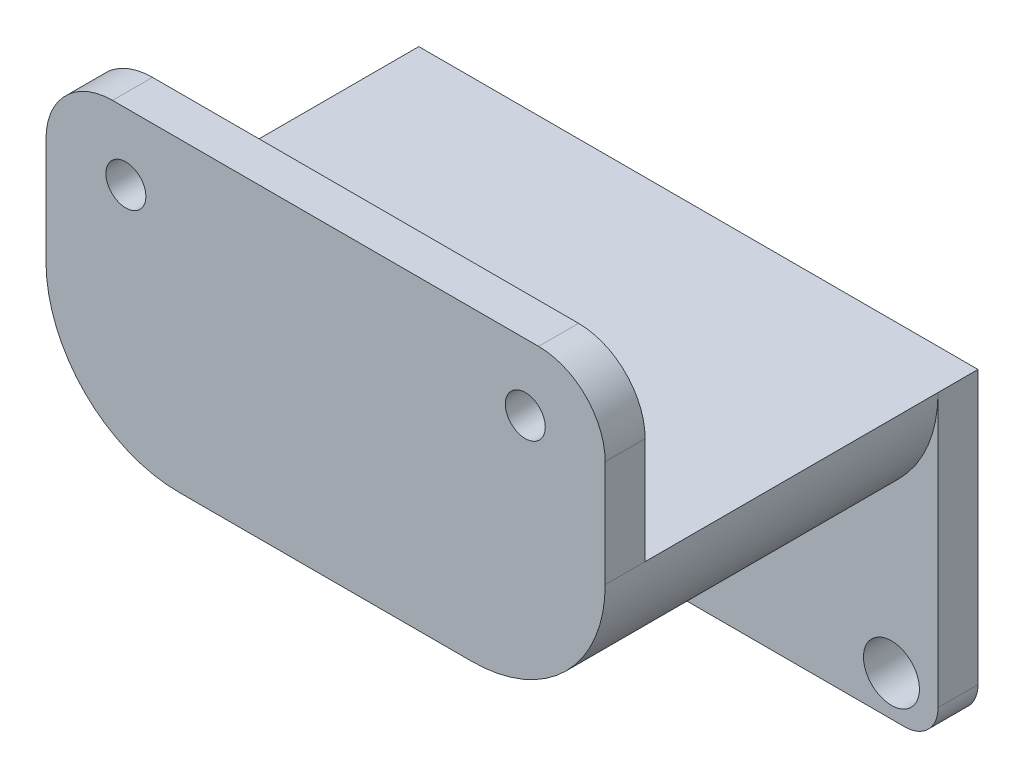
ISO-10303-21;
HEADER;
FILE_DESCRIPTION(('STEP AP214'),'2;1');
FILE_NAME('part.step','',(''),(''),'','','');
FILE_SCHEMA(('AUTOMOTIVE_DESIGN { 1 0 10303 214 1 1 1 1 }'));
ENDSEC;
DATA;
#1=APPLICATION_CONTEXT('core data for automotive mechanical design processes');
#2=APPLICATION_PROTOCOL_DEFINITION('international standard','automotive_design',2000,#1);
#3=PRODUCT_CONTEXT('',#1,'mechanical');
#4=PRODUCT('Part','Part','',(#3));
#5=PRODUCT_RELATED_PRODUCT_CATEGORY('part','',(#4));
#6=PRODUCT_DEFINITION_FORMATION('','',#4);
#7=PRODUCT_DEFINITION_CONTEXT('part definition',#1,'design');
#8=PRODUCT_DEFINITION('design','',#6,#7);
#9=PRODUCT_DEFINITION_SHAPE('','',#8);
#10=(LENGTH_UNIT() NAMED_UNIT(*) SI_UNIT(.MILLI.,.METRE.));
#11=(NAMED_UNIT(*) PLANE_ANGLE_UNIT() SI_UNIT($,.RADIAN.));
#12=(NAMED_UNIT(*) SI_UNIT($,.STERADIAN.) SOLID_ANGLE_UNIT());
#13=UNCERTAINTY_MEASURE_WITH_UNIT(LENGTH_MEASURE(1.E-05),#10,'distance_accuracy_value','');
#14=(GEOMETRIC_REPRESENTATION_CONTEXT(3) GLOBAL_UNCERTAINTY_ASSIGNED_CONTEXT((#13)) GLOBAL_UNIT_ASSIGNED_CONTEXT((#10,
#11,#12)) REPRESENTATION_CONTEXT('',''));
#15=CARTESIAN_POINT('',(0.,0.,0.));
#16=DIRECTION('',(0.,0.,1.));
#17=DIRECTION('',(1.,0.,0.));
#18=AXIS2_PLACEMENT_3D('',#15,#16,#17);
#19=CARTESIAN_POINT('',(-38.0928347928163,3.50935751029341,3.));
#20=DIRECTION('',(0.,0.,1.));
#21=DIRECTION('',(1.,0.,0.));
#22=AXIS2_PLACEMENT_3D('',#19,#20,#21);
#23=PLANE('',#22);
#24=CARTESIAN_POINT('',(-42.0928347928163,11.5093575102934,3.));
#25=DIRECTION('',(0.,0.,1.));
#26=DIRECTION('',(1.,0.,0.));
#27=AXIS2_PLACEMENT_3D('',#24,#25,#26);
#28=CIRCLE('',#27,1.5);
#29=CARTESIAN_POINT('',(-40.5928347928163,11.5093575102934,3.));
#30=VERTEX_POINT('',#29);
#31=EDGE_CURVE('E177',#30,#30,#28,.T.);
#32=ORIENTED_EDGE('',*,*,#31,.F.);
#33=EDGE_LOOP('',(#32));
#34=FACE_BOUND('',#33,.T.);
#35=DIRECTION('',(-1.,0.,0.));
#36=VECTOR('',#35,1.);
#37=CARTESIAN_POINT('',(-22.5928347928163,16.5093575102934,3.));
#38=LINE('',#37,#36);
#39=CARTESIAN_POINT('',(-11.0928347928163,16.5093575102934,3.));
#40=VERTEX_POINT('',#39);
#41=CARTESIAN_POINT('',(-43.0928347928163,16.5093575102934,3.));
#42=VERTEX_POINT('',#41);
#43=EDGE_CURVE('E195',#40,#42,#38,.T.);
#44=ORIENTED_EDGE('',*,*,#43,.T.);
#45=CARTESIAN_POINT('',(-43.0928347928163,11.5093575102934,3.));
#46=DIRECTION('',(0.,0.,1.));
#47=DIRECTION('',(1.,0.,0.));
#48=AXIS2_PLACEMENT_3D('',#45,#46,#47);
#49=CIRCLE('',#48,5.);
#50=CARTESIAN_POINT('',(-48.0928347928163,11.5093575102934,3.));
#51=VERTEX_POINT('',#50);
#52=EDGE_CURVE('E231',#42,#51,#49,.T.);
#53=ORIENTED_EDGE('',*,*,#52,.T.);
#54=DIRECTION('',(0.,-1.,0.));
#55=VECTOR('',#54,1.);
#56=CARTESIAN_POINT('',(-48.0928347928163,16.5093575102934,3.));
#57=LINE('',#56,#55);
#58=CARTESIAN_POINT('',(-48.0928347928163,3.50935751029348,3.));
#59=VERTEX_POINT('',#58);
#60=EDGE_CURVE('E183',#51,#59,#57,.T.);
#61=ORIENTED_EDGE('',*,*,#60,.T.);
#62=CARTESIAN_POINT('',(-38.0928347928163,3.50935751029341,3.));
#63=DIRECTION('',(0.,0.,1.));
#64=DIRECTION('',(1.,0.,0.));
#65=AXIS2_PLACEMENT_3D('',#62,#63,#64);
#66=CIRCLE('',#65,10.);
#67=CARTESIAN_POINT('',(-38.0928347928163,-6.49064248970659,3.));
#68=VERTEX_POINT('',#67);
#69=EDGE_CURVE('E185',#59,#68,#66,.T.);
#70=ORIENTED_EDGE('',*,*,#69,.T.);
#71=DIRECTION('',(1.,0.,0.));
#72=VECTOR('',#71,1.);
#73=CARTESIAN_POINT('',(-38.0928347928163,-6.49064248970659,3.));
#74=LINE('',#73,#72);
#75=CARTESIAN_POINT('',(-16.0928347928164,-6.49064248970659,3.));
#76=VERTEX_POINT('',#75);
#77=EDGE_CURVE('E188',#68,#76,#74,.T.);
#78=ORIENTED_EDGE('',*,*,#77,.T.);
#79=CARTESIAN_POINT('',(-16.0928347928163,3.50935751029341,3.));
#80=DIRECTION('',(0.,0.,1.));
#81=DIRECTION('',(1.,0.,0.));
#82=AXIS2_PLACEMENT_3D('',#79,#80,#81);
#83=CIRCLE('',#82,10.);
#84=CARTESIAN_POINT('',(-6.09283479281634,3.50935751029349,3.));
#85=VERTEX_POINT('',#84);
#86=EDGE_CURVE('E190',#76,#85,#83,.T.);
#87=ORIENTED_EDGE('',*,*,#86,.T.);
#88=DIRECTION('',(0.,1.,0.));
#89=VECTOR('',#88,1.);
#90=CARTESIAN_POINT('',(-6.09283479281634,16.5093575102934,3.));
#91=LINE('',#90,#89);
#92=CARTESIAN_POINT('',(-6.09283479281634,11.5093575102934,3.));
#93=VERTEX_POINT('',#92);
#94=EDGE_CURVE('E192',#85,#93,#91,.T.);
#95=ORIENTED_EDGE('',*,*,#94,.T.);
#96=CARTESIAN_POINT('',(-11.0928347928163,11.5093575102934,3.));
#97=DIRECTION('',(0.,0.,1.));
#98=DIRECTION('',(1.,0.,0.));
#99=AXIS2_PLACEMENT_3D('',#96,#97,#98);
#100=CIRCLE('',#99,5.);
#101=EDGE_CURVE('E229',#93,#40,#100,.T.);
#102=ORIENTED_EDGE('',*,*,#101,.T.);
#103=EDGE_LOOP('',(#44,#53,#61,#70,#78,#87,#95,#102));
#104=FACE_BOUND('',#103,.T.);
#105=CARTESIAN_POINT('',(-12.0928347928163,11.5093575102934,3.));
#106=DIRECTION('',(0.,0.,1.));
#107=DIRECTION('',(1.,0.,0.));
#108=AXIS2_PLACEMENT_3D('',#105,#106,#107);
#109=CIRCLE('',#108,1.5);
#110=CARTESIAN_POINT('',(-10.5928347928163,11.5093575102934,3.));
#111=VERTEX_POINT('',#110);
#112=EDGE_CURVE('E171',#111,#111,#109,.T.);
#113=ORIENTED_EDGE('',*,*,#112,.F.);
#114=EDGE_LOOP('',(#113));
#115=FACE_BOUND('',#114,.T.);
#116=ADVANCED_FACE('F33',(#34,#104,#115),#23,.T.);
#117=CARTESIAN_POINT('',(-38.0928347928163,3.50935751029341,0.));
#118=DIRECTION('',(0.,0.,1.));
#119=DIRECTION('',(1.,0.,0.));
#120=AXIS2_PLACEMENT_3D('',#117,#118,#119);
#121=PLANE('',#120);
#122=DIRECTION('',(0.,-1.,0.));
#123=VECTOR('',#122,1.);
#124=CARTESIAN_POINT('',(-48.0928347928163,16.5093575102934,0.));
#125=LINE('',#124,#123);
#126=CARTESIAN_POINT('',(-48.0928347928163,11.5093575102934,0.));
#127=VERTEX_POINT('',#126);
#128=CARTESIAN_POINT('',(-48.0928347928163,3.50935751029348,0.));
#129=VERTEX_POINT('',#128);
#130=EDGE_CURVE('E180',#127,#129,#125,.T.);
#131=ORIENTED_EDGE('',*,*,#130,.F.);
#132=CARTESIAN_POINT('',(-43.0928347928163,11.5093575102934,0.));
#133=DIRECTION('',(0.,0.,1.));
#134=DIRECTION('',(1.,0.,0.));
#135=AXIS2_PLACEMENT_3D('',#132,#133,#134);
#136=CIRCLE('',#135,5.);
#137=CARTESIAN_POINT('',(-43.0928347928163,16.5093575102934,0.));
#138=VERTEX_POINT('',#137);
#139=EDGE_CURVE('E222',#127,#138,#136,.F.);
#140=ORIENTED_EDGE('',*,*,#139,.T.);
#141=DIRECTION('',(-1.,0.,0.));
#142=VECTOR('',#141,1.);
#143=CARTESIAN_POINT('',(-48.0928347928163,16.5093575102934,0.));
#144=LINE('',#143,#142);
#145=CARTESIAN_POINT('',(-11.0928347928163,16.5093575102934,0.));
#146=VERTEX_POINT('',#145);
#147=EDGE_CURVE('E186',#146,#138,#144,.T.);
#148=ORIENTED_EDGE('',*,*,#147,.F.);
#149=CARTESIAN_POINT('',(-11.0928347928163,11.5093575102934,0.));
#150=DIRECTION('',(0.,0.,1.));
#151=DIRECTION('',(1.,0.,0.));
#152=AXIS2_PLACEMENT_3D('',#149,#150,#151);
#153=CIRCLE('',#152,5.);
#154=CARTESIAN_POINT('',(-6.09283479281634,11.5093575102934,0.));
#155=VERTEX_POINT('',#154);
#156=EDGE_CURVE('E220',#146,#155,#153,.F.);
#157=ORIENTED_EDGE('',*,*,#156,.T.);
#158=DIRECTION('',(0.,1.,0.));
#159=VECTOR('',#158,1.);
#160=CARTESIAN_POINT('',(-6.09283479281634,16.5093575102934,0.));
#161=LINE('',#160,#159);
#162=CARTESIAN_POINT('',(-6.09283479281633,3.50935751029341,0.));
#163=VERTEX_POINT('',#162);
#164=EDGE_CURVE('E201',#163,#155,#161,.T.);
#165=ORIENTED_EDGE('',*,*,#164,.F.);
#166=DIRECTION('',(-1.,0.,0.));
#167=VECTOR('',#166,1.);
#168=CARTESIAN_POINT('',(-6.09283479281633,3.50935751029341,0.));
#169=LINE('',#168,#167);
#170=EDGE_CURVE('E160',#163,#129,#169,.T.);
#171=ORIENTED_EDGE('',*,*,#170,.T.);
#172=EDGE_LOOP('',(#131,#140,#148,#157,#165,#171));
#173=FACE_BOUND('',#172,.T.);
#174=CARTESIAN_POINT('',(-42.0928347928163,11.5093575102934,0.));
#175=DIRECTION('',(0.,0.,1.));
#176=DIRECTION('',(1.,0.,0.));
#177=AXIS2_PLACEMENT_3D('',#174,#175,#176);
#178=CIRCLE('',#177,1.5);
#179=CARTESIAN_POINT('',(-40.5928347928163,11.5093575102934,0.));
#180=VERTEX_POINT('',#179);
#181=EDGE_CURVE('E174',#180,#180,#178,.T.);
#182=ORIENTED_EDGE('',*,*,#181,.T.);
#183=EDGE_LOOP('',(#182));
#184=FACE_BOUND('',#183,.T.);
#185=CARTESIAN_POINT('',(-12.0928347928163,11.5093575102934,0.));
#186=DIRECTION('',(0.,0.,1.));
#187=DIRECTION('',(1.,0.,0.));
#188=AXIS2_PLACEMENT_3D('',#185,#186,#187);
#189=CIRCLE('',#188,1.5);
#190=CARTESIAN_POINT('',(-10.5928347928163,11.5093575102934,0.));
#191=VERTEX_POINT('',#190);
#192=EDGE_CURVE('E169',#191,#191,#189,.T.);
#193=ORIENTED_EDGE('',*,*,#192,.T.);
#194=EDGE_LOOP('',(#193));
#195=FACE_BOUND('',#194,.T.);
#196=ADVANCED_FACE('F299',(#173,#184,#195),#121,.F.);
#197=CARTESIAN_POINT('',(-48.0928347928163,16.5093575102934,3.));
#198=DIRECTION('',(1.,0.,0.));
#199=DIRECTION('',(0.,1.,0.));
#200=AXIS2_PLACEMENT_3D('',#197,#198,#199);
#201=PLANE('',#200);
#202=ORIENTED_EDGE('',*,*,#60,.F.);
#203=DIRECTION('',(0.,0.,-1.));
#204=VECTOR('',#203,1.);
#205=CARTESIAN_POINT('',(-48.0928347928163,11.5093575102934,3.));
#206=LINE('',#205,#204);
#207=EDGE_CURVE('E217',#51,#127,#206,.T.);
#208=ORIENTED_EDGE('',*,*,#207,.T.);
#209=ORIENTED_EDGE('',*,*,#130,.T.);
#210=DIRECTION('',(0.,0.,-1.));
#211=VECTOR('',#210,1.);
#212=CARTESIAN_POINT('',(-48.0928347928163,3.50935751029348,3.));
#213=LINE('',#212,#211);
#214=EDGE_CURVE('E214',#59,#129,#213,.T.);
#215=ORIENTED_EDGE('',*,*,#214,.F.);
#216=EDGE_LOOP('',(#202,#208,#209,#215));
#217=FACE_BOUND('',#216,.T.);
#218=ADVANCED_FACE('F294',(#217),#201,.F.);
#219=CARTESIAN_POINT('',(-38.0928347928163,3.50935751029341,3.));
#220=DIRECTION('',(0.,0.,-1.));
#221=DIRECTION('',(-1.,0.,0.));
#222=AXIS2_PLACEMENT_3D('',#219,#220,#221);
#223=CYLINDRICAL_SURFACE('',#222,10.);
#224=DIRECTION('',(0.,0.,1.));
#225=VECTOR('',#224,1.);
#226=CARTESIAN_POINT('',(-48.0928347928163,3.50935751029341,-25.));
#227=LINE('',#226,#225);
#228=CARTESIAN_POINT('',(-48.0928347928163,3.50935751029341,-22.));
#229=VERTEX_POINT('',#228);
#230=EDGE_CURVE('E155',#229,#129,#227,.T.);
#231=ORIENTED_EDGE('',*,*,#230,.F.);
#232=CARTESIAN_POINT('',(-38.0928347928163,3.50935751029341,-22.));
#233=DIRECTION('',(0.,0.,1.));
#234=DIRECTION('',(1.,0.,0.));
#235=AXIS2_PLACEMENT_3D('',#232,#233,#234);
#236=CIRCLE('',#235,10.);
#237=CARTESIAN_POINT('',(-38.0928347928163,-6.49064248970659,-22.));
#238=VERTEX_POINT('',#237);
#239=EDGE_CURVE('E163',#229,#238,#236,.T.);
#240=ORIENTED_EDGE('',*,*,#239,.T.);
#241=DIRECTION('',(0.,0.,-1.));
#242=VECTOR('',#241,1.);
#243=CARTESIAN_POINT('',(-38.0928347928163,-6.49064248970659,3.));
#244=LINE('',#243,#242);
#245=EDGE_CURVE('E211',#68,#238,#244,.T.);
#246=ORIENTED_EDGE('',*,*,#245,.F.);
#247=ORIENTED_EDGE('',*,*,#69,.F.);
#248=ORIENTED_EDGE('',*,*,#214,.T.);
#249=EDGE_LOOP('',(#231,#240,#246,#247,#248));
#250=FACE_BOUND('',#249,.T.);
#251=ADVANCED_FACE('F283',(#250),#223,.T.);
#252=CARTESIAN_POINT('',(-38.0928347928163,-6.49064248970659,3.));
#253=DIRECTION('',(0.,1.,0.));
#254=DIRECTION('',(-1.,0.,0.));
#255=AXIS2_PLACEMENT_3D('',#252,#253,#254);
#256=PLANE('',#255);
#257=ORIENTED_EDGE('',*,*,#245,.T.);
#258=DIRECTION('',(1.,0.,0.));
#259=VECTOR('',#258,1.);
#260=CARTESIAN_POINT('',(-38.0928347928163,-6.49064248970659,-22.));
#261=LINE('',#260,#259);
#262=CARTESIAN_POINT('',(-16.0928347928164,-6.49064248970659,-22.));
#263=VERTEX_POINT('',#262);
#264=EDGE_CURVE('E275',#238,#263,#261,.T.);
#265=ORIENTED_EDGE('',*,*,#264,.T.);
#266=DIRECTION('',(0.,0.,-1.));
#267=VECTOR('',#266,1.);
#268=CARTESIAN_POINT('',(-16.0928347928164,-6.49064248970659,3.));
#269=LINE('',#268,#267);
#270=EDGE_CURVE('E208',#76,#263,#269,.T.);
#271=ORIENTED_EDGE('',*,*,#270,.F.);
#272=ORIENTED_EDGE('',*,*,#77,.F.);
#273=EDGE_LOOP('',(#257,#265,#271,#272));
#274=FACE_BOUND('',#273,.T.);
#275=ADVANCED_FACE('F286',(#274),#256,.F.);
#276=CARTESIAN_POINT('',(-16.0928347928163,3.50935751029341,3.));
#277=DIRECTION('',(0.,0.,-1.));
#278=DIRECTION('',(-1.,0.,0.));
#279=AXIS2_PLACEMENT_3D('',#276,#277,#278);
#280=CYLINDRICAL_SURFACE('',#279,10.);
#281=ORIENTED_EDGE('',*,*,#270,.T.);
#282=CARTESIAN_POINT('',(-16.0928347928163,3.50935751029341,-22.));
#283=DIRECTION('',(0.,0.,1.));
#284=DIRECTION('',(1.,0.,0.));
#285=AXIS2_PLACEMENT_3D('',#282,#283,#284);
#286=CIRCLE('',#285,10.);
#287=CARTESIAN_POINT('',(-6.09283479281633,3.50935751029341,-22.));
#288=VERTEX_POINT('',#287);
#289=EDGE_CURVE('E274',#263,#288,#286,.T.);
#290=ORIENTED_EDGE('',*,*,#289,.T.);
#291=DIRECTION('',(0.,0.,1.));
#292=VECTOR('',#291,1.);
#293=CARTESIAN_POINT('',(-6.09283479281633,3.50935751029341,-25.));
#294=LINE('',#293,#292);
#295=EDGE_CURVE('E154',#288,#163,#294,.T.);
#296=ORIENTED_EDGE('',*,*,#295,.T.);
#297=DIRECTION('',(0.,0.,-1.));
#298=VECTOR('',#297,1.);
#299=CARTESIAN_POINT('',(-6.09283479281634,3.50935751029349,3.));
#300=LINE('',#299,#298);
#301=EDGE_CURVE('E198',#85,#163,#300,.T.);
#302=ORIENTED_EDGE('',*,*,#301,.F.);
#303=ORIENTED_EDGE('',*,*,#86,.F.);
#304=EDGE_LOOP('',(#281,#290,#296,#302,#303));
#305=FACE_BOUND('',#304,.T.);
#306=ADVANCED_FACE('F306',(#305),#280,.T.);
#307=CARTESIAN_POINT('',(-6.09283479281634,16.5093575102934,3.));
#308=DIRECTION('',(-1.,0.,0.));
#309=DIRECTION('',(0.,0.,1.));
#310=AXIS2_PLACEMENT_3D('',#307,#308,#309);
#311=PLANE('',#310);
#312=ORIENTED_EDGE('',*,*,#164,.T.);
#313=DIRECTION('',(0.,0.,-1.));
#314=VECTOR('',#313,1.);
#315=CARTESIAN_POINT('',(-6.09283479281634,11.5093575102934,3.));
#316=LINE('',#315,#314);
#317=EDGE_CURVE('E233',#155,#93,#316,.F.);
#318=ORIENTED_EDGE('',*,*,#317,.T.);
#319=ORIENTED_EDGE('',*,*,#94,.F.);
#320=ORIENTED_EDGE('',*,*,#301,.T.);
#321=EDGE_LOOP('',(#312,#318,#319,#320));
#322=FACE_BOUND('',#321,.T.);
#323=ADVANCED_FACE('F303',(#322),#311,.F.);
#324=CARTESIAN_POINT('',(-48.0928347928163,16.5093575102934,3.));
#325=DIRECTION('',(0.,-1.,0.));
#326=DIRECTION('',(1.,0.,0.));
#327=AXIS2_PLACEMENT_3D('',#324,#325,#326);
#328=PLANE('',#327);
#329=ORIENTED_EDGE('',*,*,#147,.T.);
#330=DIRECTION('',(0.,0.,-1.));
#331=VECTOR('',#330,1.);
#332=CARTESIAN_POINT('',(-43.0928347928163,16.5093575102934,3.));
#333=LINE('',#332,#331);
#334=EDGE_CURVE('E227',#138,#42,#333,.F.);
#335=ORIENTED_EDGE('',*,*,#334,.T.);
#336=ORIENTED_EDGE('',*,*,#43,.F.);
#337=DIRECTION('',(0.,0.,-1.));
#338=VECTOR('',#337,1.);
#339=CARTESIAN_POINT('',(-11.0928347928163,16.5093575102934,3.));
#340=LINE('',#339,#338);
#341=EDGE_CURVE('E224',#40,#146,#340,.T.);
#342=ORIENTED_EDGE('',*,*,#341,.T.);
#343=EDGE_LOOP('',(#329,#335,#336,#342));
#344=FACE_BOUND('',#343,.T.);
#345=ADVANCED_FACE('F329',(#344),#328,.F.);
#346=CARTESIAN_POINT('',(-42.0928347928163,11.5093575102934,3.));
#347=DIRECTION('',(0.,0.,-1.));
#348=DIRECTION('',(-1.,0.,0.));
#349=AXIS2_PLACEMENT_3D('',#346,#347,#348);
#350=CYLINDRICAL_SURFACE('',#349,1.5);
#351=ORIENTED_EDGE('',*,*,#31,.T.);
#352=EDGE_LOOP('',(#351));
#353=FACE_BOUND('',#352,.T.);
#354=ORIENTED_EDGE('',*,*,#181,.F.);
#355=EDGE_LOOP('',(#354));
#356=FACE_BOUND('',#355,.T.);
#357=ADVANCED_FACE('F326',(#353,#356),#350,.F.);
#358=CARTESIAN_POINT('',(-12.0928347928163,11.5093575102934,3.));
#359=DIRECTION('',(0.,0.,-1.));
#360=DIRECTION('',(-1.,0.,0.));
#361=AXIS2_PLACEMENT_3D('',#358,#359,#360);
#362=CYLINDRICAL_SURFACE('',#361,1.5);
#363=ORIENTED_EDGE('',*,*,#112,.T.);
#364=EDGE_LOOP('',(#363));
#365=FACE_BOUND('',#364,.T.);
#366=ORIENTED_EDGE('',*,*,#192,.F.);
#367=EDGE_LOOP('',(#366));
#368=FACE_BOUND('',#367,.T.);
#369=ADVANCED_FACE('F374',(#365,#368),#362,.F.);
#370=CARTESIAN_POINT('',(-6.09283479281633,3.50935751029341,-25.));
#371=DIRECTION('',(0.,1.,0.));
#372=DIRECTION('',(-1.,0.,0.));
#373=AXIS2_PLACEMENT_3D('',#370,#371,#372);
#374=PLANE('',#373);
#375=ORIENTED_EDGE('',*,*,#295,.F.);
#376=CARTESIAN_POINT('',(-6.09283479281633,3.50935751029341,-25.));
#377=VERTEX_POINT('',#376);
#378=EDGE_CURVE('E139',#377,#288,#294,.T.);
#379=ORIENTED_EDGE('',*,*,#378,.F.);
#380=DIRECTION('',(-1.,0.,0.));
#381=VECTOR('',#380,1.);
#382=CARTESIAN_POINT('',(-6.09283479281633,3.50935751029341,-25.));
#383=LINE('',#382,#381);
#384=CARTESIAN_POINT('',(-48.0928347928163,3.50935751029341,-25.));
#385=VERTEX_POINT('',#384);
#386=EDGE_CURVE('E152',#377,#385,#383,.T.);
#387=ORIENTED_EDGE('',*,*,#386,.T.);
#388=EDGE_CURVE('E168',#385,#229,#227,.T.);
#389=ORIENTED_EDGE('',*,*,#388,.T.);
#390=ORIENTED_EDGE('',*,*,#230,.T.);
#391=ORIENTED_EDGE('',*,*,#170,.F.);
#392=EDGE_LOOP('',(#375,#379,#387,#389,#390,#391));
#393=FACE_BOUND('',#392,.T.);
#394=ADVANCED_FACE('F150',(#393),#374,.T.);
#395=CARTESIAN_POINT('',(-38.0928347928163,3.50935751029341,-25.));
#396=DIRECTION('',(0.,0.,1.));
#397=DIRECTION('',(1.,0.,0.));
#398=AXIS2_PLACEMENT_3D('',#395,#396,#397);
#399=PLANE('',#398);
#400=CARTESIAN_POINT('',(-9.59283479281628,-16.4906424897066,-25.));
#401=DIRECTION('',(0.,0.,-1.));
#402=DIRECTION('',(-1.,0.,0.));
#403=AXIS2_PLACEMENT_3D('',#400,#401,#402);
#404=CIRCLE('',#403,2.1);
#405=CARTESIAN_POINT('',(-11.6928347928163,-16.4906424897066,-25.));
#406=VERTEX_POINT('',#405);
#407=EDGE_CURVE('E239',#406,#406,#404,.T.);
#408=ORIENTED_EDGE('',*,*,#407,.F.);
#409=EDGE_LOOP('',(#408));
#410=FACE_BOUND('',#409,.T.);
#411=CARTESIAN_POINT('',(-44.5928347928163,-16.4906424897066,-25.));
#412=DIRECTION('',(0.,0.,-1.));
#413=DIRECTION('',(-1.,0.,0.));
#414=AXIS2_PLACEMENT_3D('',#411,#412,#413);
#415=CIRCLE('',#414,2.1);
#416=CARTESIAN_POINT('',(-46.6928347928163,-16.4906424897066,-25.));
#417=VERTEX_POINT('',#416);
#418=EDGE_CURVE('E264',#417,#417,#415,.T.);
#419=ORIENTED_EDGE('',*,*,#418,.F.);
#420=EDGE_LOOP('',(#419));
#421=FACE_BOUND('',#420,.T.);
#422=DIRECTION('',(1.,0.,0.));
#423=VECTOR('',#422,1.);
#424=CARTESIAN_POINT('',(-6.09283479281628,-19.4906424897066,-25.));
#425=LINE('',#424,#423);
#426=CARTESIAN_POINT('',(-45.5928347928163,-19.4906424897066,-25.));
#427=VERTEX_POINT('',#426);
#428=CARTESIAN_POINT('',(-8.59283479281633,-19.4906424897066,-25.));
#429=VERTEX_POINT('',#428);
#430=EDGE_CURVE('E265',#427,#429,#425,.T.);
#431=ORIENTED_EDGE('',*,*,#430,.F.);
#432=CARTESIAN_POINT('',(-45.5928347928163,-16.9906424897066,-25.));
#433=DIRECTION('',(0.,0.,1.));
#434=DIRECTION('',(1.,0.,0.));
#435=AXIS2_PLACEMENT_3D('',#432,#433,#434);
#436=CIRCLE('',#435,2.5);
#437=CARTESIAN_POINT('',(-48.0928347928163,-16.9906424897066,-25.));
#438=VERTEX_POINT('',#437);
#439=EDGE_CURVE('E248',#427,#438,#436,.F.);
#440=ORIENTED_EDGE('',*,*,#439,.T.);
#441=DIRECTION('',(0.,1.,0.));
#442=VECTOR('',#441,1.);
#443=CARTESIAN_POINT('',(-48.0928347928163,-26.4906424897066,-25.));
#444=LINE('',#443,#442);
#445=EDGE_CURVE('E144',#438,#385,#444,.T.);
#446=ORIENTED_EDGE('',*,*,#445,.T.);
#447=ORIENTED_EDGE('',*,*,#386,.F.);
#448=DIRECTION('',(0.,1.,0.));
#449=VECTOR('',#448,1.);
#450=CARTESIAN_POINT('',(-6.09283479281633,-26.4906424897066,-25.));
#451=LINE('',#450,#449);
#452=CARTESIAN_POINT('',(-6.09283479281633,-16.9906424897066,-25.));
#453=VERTEX_POINT('',#452);
#454=EDGE_CURVE('E136',#453,#377,#451,.T.);
#455=ORIENTED_EDGE('',*,*,#454,.F.);
#456=CARTESIAN_POINT('',(-8.59283479281633,-16.9906424897066,-25.));
#457=DIRECTION('',(0.,0.,1.));
#458=DIRECTION('',(1.,0.,0.));
#459=AXIS2_PLACEMENT_3D('',#456,#457,#458);
#460=CIRCLE('',#459,2.5);
#461=EDGE_CURVE('E246',#453,#429,#460,.F.);
#462=ORIENTED_EDGE('',*,*,#461,.T.);
#463=EDGE_LOOP('',(#431,#440,#446,#447,#455,#462));
#464=FACE_BOUND('',#463,.T.);
#465=ADVANCED_FACE('F158',(#410,#421,#464),#399,.F.);
#466=CARTESIAN_POINT('',(-43.0928347928163,11.5093575102934,3.));
#467=DIRECTION('',(0.,0.,-1.));
#468=DIRECTION('',(-1.,0.,0.));
#469=AXIS2_PLACEMENT_3D('',#466,#467,#468);
#470=CYLINDRICAL_SURFACE('',#469,5.);
#471=ORIENTED_EDGE('',*,*,#52,.F.);
#472=ORIENTED_EDGE('',*,*,#334,.F.);
#473=ORIENTED_EDGE('',*,*,#139,.F.);
#474=ORIENTED_EDGE('',*,*,#207,.F.);
#475=EDGE_LOOP('',(#471,#472,#473,#474));
#476=FACE_BOUND('',#475,.T.);
#477=ADVANCED_FACE('F343',(#476),#470,.T.);
#478=CARTESIAN_POINT('',(-11.0928347928163,11.5093575102934,3.));
#479=DIRECTION('',(0.,0.,-1.));
#480=DIRECTION('',(-1.,0.,0.));
#481=AXIS2_PLACEMENT_3D('',#478,#479,#480);
#482=CYLINDRICAL_SURFACE('',#481,5.);
#483=ORIENTED_EDGE('',*,*,#101,.F.);
#484=ORIENTED_EDGE('',*,*,#317,.F.);
#485=ORIENTED_EDGE('',*,*,#156,.F.);
#486=ORIENTED_EDGE('',*,*,#341,.F.);
#487=EDGE_LOOP('',(#483,#484,#485,#486));
#488=FACE_BOUND('',#487,.T.);
#489=ADVANCED_FACE('F346',(#488),#482,.T.);
#490=CARTESIAN_POINT('',(-6.09283479281633,-26.4906424897066,-22.));
#491=DIRECTION('',(0.,0.,1.));
#492=DIRECTION('',(1.,0.,0.));
#493=AXIS2_PLACEMENT_3D('',#490,#491,#492);
#494=PLANE('',#493);
#495=DIRECTION('',(0.,1.,0.));
#496=VECTOR('',#495,1.);
#497=CARTESIAN_POINT('',(-48.0928347928163,-26.4906424897066,-22.));
#498=LINE('',#497,#496);
#499=CARTESIAN_POINT('',(-48.0928347928163,-16.9906424897066,-22.));
#500=VERTEX_POINT('',#499);
#501=EDGE_CURVE('E257',#500,#229,#498,.T.);
#502=ORIENTED_EDGE('',*,*,#501,.F.);
#503=CARTESIAN_POINT('',(-45.5928347928163,-16.9906424897066,-22.));
#504=DIRECTION('',(0.,0.,1.));
#505=DIRECTION('',(1.,0.,0.));
#506=AXIS2_PLACEMENT_3D('',#503,#504,#505);
#507=CIRCLE('',#506,2.5);
#508=CARTESIAN_POINT('',(-45.5928347928163,-19.4906424897066,-22.));
#509=VERTEX_POINT('',#508);
#510=EDGE_CURVE('E41',#500,#509,#507,.T.);
#511=ORIENTED_EDGE('',*,*,#510,.T.);
#512=DIRECTION('',(-1.,0.,0.));
#513=VECTOR('',#512,1.);
#514=CARTESIAN_POINT('',(-6.09283479281633,-19.4906424897066,-22.));
#515=LINE('',#514,#513);
#516=CARTESIAN_POINT('',(-8.59283479281633,-19.4906424897066,-22.));
#517=VERTEX_POINT('',#516);
#518=EDGE_CURVE('E255',#517,#509,#515,.T.);
#519=ORIENTED_EDGE('',*,*,#518,.F.);
#520=CARTESIAN_POINT('',(-8.59283479281633,-16.9906424897066,-22.));
#521=DIRECTION('',(0.,0.,1.));
#522=DIRECTION('',(1.,0.,0.));
#523=AXIS2_PLACEMENT_3D('',#520,#521,#522);
#524=CIRCLE('',#523,2.5);
#525=CARTESIAN_POINT('',(-6.09283479281633,-16.9906424897066,-22.));
#526=VERTEX_POINT('',#525);
#527=EDGE_CURVE('E48',#517,#526,#524,.T.);
#528=ORIENTED_EDGE('',*,*,#527,.T.);
#529=DIRECTION('',(0.,1.,0.));
#530=VECTOR('',#529,1.);
#531=CARTESIAN_POINT('',(-6.09283479281633,-26.4906424897066,-22.));
#532=LINE('',#531,#530);
#533=EDGE_CURVE('E270',#526,#288,#532,.T.);
#534=ORIENTED_EDGE('',*,*,#533,.T.);
#535=ORIENTED_EDGE('',*,*,#289,.F.);
#536=ORIENTED_EDGE('',*,*,#264,.F.);
#537=ORIENTED_EDGE('',*,*,#239,.F.);
#538=EDGE_LOOP('',(#502,#511,#519,#528,#534,#535,#536,#537));
#539=FACE_BOUND('',#538,.T.);
#540=CARTESIAN_POINT('',(-9.59283479281628,-16.4906424897066,-22.));
#541=DIRECTION('',(0.,0.,1.));
#542=DIRECTION('',(1.,0.,0.));
#543=AXIS2_PLACEMENT_3D('',#540,#541,#542);
#544=CIRCLE('',#543,2.1);
#545=CARTESIAN_POINT('',(-7.49283479281628,-16.4906424897066,-22.));
#546=VERTEX_POINT('',#545);
#547=EDGE_CURVE('E145',#546,#546,#544,.T.);
#548=ORIENTED_EDGE('',*,*,#547,.F.);
#549=EDGE_LOOP('',(#548));
#550=FACE_BOUND('',#549,.T.);
#551=CARTESIAN_POINT('',(-44.5928347928163,-16.4906424897066,-22.));
#552=DIRECTION('',(0.,0.,1.));
#553=DIRECTION('',(1.,0.,0.));
#554=AXIS2_PLACEMENT_3D('',#551,#552,#553);
#555=CIRCLE('',#554,2.1);
#556=CARTESIAN_POINT('',(-42.4928347928163,-16.4906424897066,-22.));
#557=VERTEX_POINT('',#556);
#558=EDGE_CURVE('E236',#557,#557,#555,.T.);
#559=ORIENTED_EDGE('',*,*,#558,.F.);
#560=EDGE_LOOP('',(#559));
#561=FACE_BOUND('',#560,.T.);
#562=ADVANCED_FACE('F253',(#539,#550,#561),#494,.T.);
#563=CARTESIAN_POINT('',(-6.09283479281633,-26.4906424897066,-25.));
#564=DIRECTION('',(1.,0.,0.));
#565=DIRECTION('',(0.,1.,0.));
#566=AXIS2_PLACEMENT_3D('',#563,#564,#565);
#567=PLANE('',#566);
#568=ORIENTED_EDGE('',*,*,#533,.F.);
#569=DIRECTION('',(0.,0.,-1.));
#570=VECTOR('',#569,1.);
#571=CARTESIAN_POINT('',(-6.09283479281633,-16.9906424897066,-25.));
#572=LINE('',#571,#570);
#573=EDGE_CURVE('E11',#526,#453,#572,.T.);
#574=ORIENTED_EDGE('',*,*,#573,.T.);
#575=ORIENTED_EDGE('',*,*,#454,.T.);
#576=ORIENTED_EDGE('',*,*,#378,.T.);
#577=EDGE_LOOP('',(#568,#574,#575,#576));
#578=FACE_BOUND('',#577,.T.);
#579=ADVANCED_FACE('F138',(#578),#567,.T.);
#580=CARTESIAN_POINT('',(-48.0928347928163,-26.4906424897066,-25.));
#581=DIRECTION('',(-1.,0.,0.));
#582=DIRECTION('',(0.,-1.,0.));
#583=AXIS2_PLACEMENT_3D('',#580,#581,#582);
#584=PLANE('',#583);
#585=ORIENTED_EDGE('',*,*,#445,.F.);
#586=DIRECTION('',(0.,0.,-1.));
#587=VECTOR('',#586,1.);
#588=CARTESIAN_POINT('',(-48.0928347928163,-16.9906424897066,-22.));
#589=LINE('',#588,#587);
#590=EDGE_CURVE('E56',#438,#500,#589,.F.);
#591=ORIENTED_EDGE('',*,*,#590,.T.);
#592=ORIENTED_EDGE('',*,*,#501,.T.);
#593=ORIENTED_EDGE('',*,*,#388,.F.);
#594=EDGE_LOOP('',(#585,#591,#592,#593));
#595=FACE_BOUND('',#594,.T.);
#596=ADVANCED_FACE('F268',(#595),#584,.T.);
#597=CARTESIAN_POINT('',(-44.5928347928163,-16.4906424897066,5.));
#598=DIRECTION('',(0.,0.,-1.));
#599=DIRECTION('',(-1.,0.,0.));
#600=AXIS2_PLACEMENT_3D('',#597,#598,#599);
#601=CYLINDRICAL_SURFACE('',#600,2.1);
#602=ORIENTED_EDGE('',*,*,#558,.T.);
#603=EDGE_LOOP('',(#602));
#604=FACE_BOUND('',#603,.T.);
#605=ORIENTED_EDGE('',*,*,#418,.T.);
#606=EDGE_LOOP('',(#605));
#607=FACE_BOUND('',#606,.T.);
#608=ADVANCED_FACE('F366',(#604,#607),#601,.F.);
#609=CARTESIAN_POINT('',(-9.59283479281628,-16.4906424897066,5.));
#610=DIRECTION('',(0.,0.,-1.));
#611=DIRECTION('',(-1.,0.,0.));
#612=AXIS2_PLACEMENT_3D('',#609,#610,#611);
#613=CYLINDRICAL_SURFACE('',#612,2.1);
#614=ORIENTED_EDGE('',*,*,#547,.T.);
#615=EDGE_LOOP('',(#614));
#616=FACE_BOUND('',#615,.T.);
#617=ORIENTED_EDGE('',*,*,#407,.T.);
#618=EDGE_LOOP('',(#617));
#619=FACE_BOUND('',#618,.T.);
#620=ADVANCED_FACE('F474',(#616,#619),#613,.F.);
#621=CARTESIAN_POINT('',(-6.09283479281628,-19.4906424897066,-15.));
#622=DIRECTION('',(0.,1.,0.));
#623=DIRECTION('',(0.,0.,1.));
#624=AXIS2_PLACEMENT_3D('',#621,#622,#623);
#625=PLANE('',#624);
#626=ORIENTED_EDGE('',*,*,#518,.T.);
#627=DIRECTION('',(0.,0.,-1.));
#628=VECTOR('',#627,1.);
#629=CARTESIAN_POINT('',(-45.5928347928163,-19.4906424897066,-25.));
#630=LINE('',#629,#628);
#631=EDGE_CURVE('E243',#509,#427,#630,.T.);
#632=ORIENTED_EDGE('',*,*,#631,.T.);
#633=ORIENTED_EDGE('',*,*,#430,.T.);
#634=DIRECTION('',(0.,0.,-1.));
#635=VECTOR('',#634,1.);
#636=CARTESIAN_POINT('',(-8.59283479281633,-19.4906424897066,-22.));
#637=LINE('',#636,#635);
#638=EDGE_CURVE('E235',#429,#517,#637,.F.);
#639=ORIENTED_EDGE('',*,*,#638,.T.);
#640=EDGE_LOOP('',(#626,#632,#633,#639));
#641=FACE_BOUND('',#640,.T.);
#642=ADVANCED_FACE('F261',(#641),#625,.F.);
#643=CARTESIAN_POINT('',(-45.5928347928163,-16.9906424897066,-15.));
#644=DIRECTION('',(0.,0.,1.));
#645=DIRECTION('',(1.,0.,0.));
#646=AXIS2_PLACEMENT_3D('',#643,#644,#645);
#647=CYLINDRICAL_SURFACE('',#646,2.5);
#648=ORIENTED_EDGE('',*,*,#510,.F.);
#649=ORIENTED_EDGE('',*,*,#590,.F.);
#650=ORIENTED_EDGE('',*,*,#439,.F.);
#651=ORIENTED_EDGE('',*,*,#631,.F.);
#652=EDGE_LOOP('',(#648,#649,#650,#651));
#653=FACE_BOUND('',#652,.T.);
#654=ADVANCED_FACE('F267',(#653),#647,.T.);
#655=CARTESIAN_POINT('',(-8.59283479281633,-16.9906424897066,-25.));
#656=DIRECTION('',(0.,0.,1.));
#657=DIRECTION('',(1.,0.,0.));
#658=AXIS2_PLACEMENT_3D('',#655,#656,#657);
#659=CYLINDRICAL_SURFACE('',#658,2.5);
#660=ORIENTED_EDGE('',*,*,#527,.F.);
#661=ORIENTED_EDGE('',*,*,#638,.F.);
#662=ORIENTED_EDGE('',*,*,#461,.F.);
#663=ORIENTED_EDGE('',*,*,#573,.F.);
#664=EDGE_LOOP('',(#660,#661,#662,#663));
#665=FACE_BOUND('',#664,.T.);
#666=ADVANCED_FACE('F35',(#665),#659,.T.);
#667=CLOSED_SHELL('',(#116,#196,#218,#251,#275,#306,#323,#345,#357,#369,#394,#465,#477,#489,
#562,#579,#596,#608,#620,#642,#654,#666));
#668=MANIFOLD_SOLID_BREP('B2',#667);
#669=ADVANCED_BREP_SHAPE_REPRESENTATION('',(#18,#668),#14);
#670=SHAPE_DEFINITION_REPRESENTATION(#9,#669);
ENDSEC;
END-ISO-10303-21;
